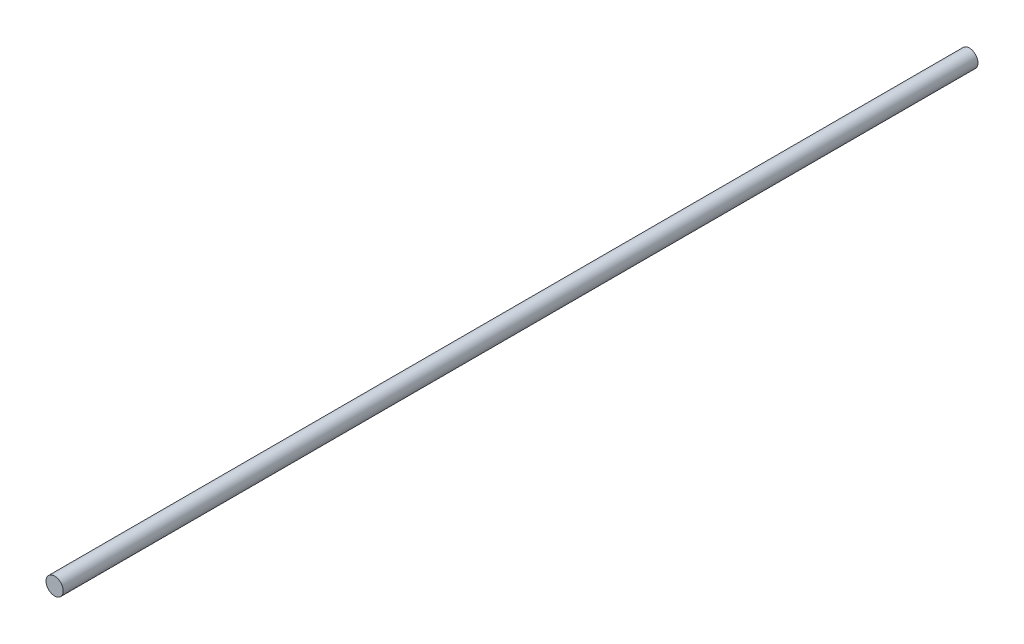
ISO-10303-21;
HEADER;
FILE_DESCRIPTION(('STEP AP214'),'2;1');
FILE_NAME('part.step','',(''),(''),'','','');
FILE_SCHEMA(('AUTOMOTIVE_DESIGN { 1 0 10303 214 1 1 1 1 }'));
ENDSEC;
DATA;
#1=APPLICATION_CONTEXT('core data for automotive mechanical design processes');
#2=APPLICATION_PROTOCOL_DEFINITION('international standard','automotive_design',2000,#1);
#3=PRODUCT_CONTEXT('',#1,'mechanical');
#4=PRODUCT('Part','Part','',(#3));
#5=PRODUCT_RELATED_PRODUCT_CATEGORY('part','',(#4));
#6=PRODUCT_DEFINITION_FORMATION('','',#4);
#7=PRODUCT_DEFINITION_CONTEXT('part definition',#1,'design');
#8=PRODUCT_DEFINITION('design','',#6,#7);
#9=PRODUCT_DEFINITION_SHAPE('','',#8);
#10=(LENGTH_UNIT() NAMED_UNIT(*) SI_UNIT(.MILLI.,.METRE.));
#11=(NAMED_UNIT(*) PLANE_ANGLE_UNIT() SI_UNIT($,.RADIAN.));
#12=(NAMED_UNIT(*) SI_UNIT($,.STERADIAN.) SOLID_ANGLE_UNIT());
#13=UNCERTAINTY_MEASURE_WITH_UNIT(LENGTH_MEASURE(1.E-05),#10,'distance_accuracy_value','');
#14=(GEOMETRIC_REPRESENTATION_CONTEXT(3) GLOBAL_UNCERTAINTY_ASSIGNED_CONTEXT((#13)) GLOBAL_UNIT_ASSIGNED_CONTEXT((#10,
#11,#12)) REPRESENTATION_CONTEXT('',''));
#15=CARTESIAN_POINT('',(0.,0.,0.));
#16=DIRECTION('',(0.,0.,1.));
#17=DIRECTION('',(1.,0.,0.));
#18=AXIS2_PLACEMENT_3D('',#15,#16,#17);
#19=CARTESIAN_POINT('',(0.,0.,530.));
#20=DIRECTION('',(0.,0.,-1.));
#21=DIRECTION('',(-1.,0.,0.));
#22=AXIS2_PLACEMENT_3D('',#19,#20,#21);
#23=CYLINDRICAL_SURFACE('',#22,10.);
#24=CARTESIAN_POINT('',(0.,0.,530.));
#25=DIRECTION('',(0.,0.,1.));
#26=DIRECTION('',(1.,0.,0.));
#27=AXIS2_PLACEMENT_3D('',#24,#25,#26);
#28=CIRCLE('',#27,10.);
#29=CARTESIAN_POINT('',(10.,0.,530.));
#30=VERTEX_POINT('',#29);
#31=EDGE_CURVE('E10',#30,#30,#28,.T.);
#32=ORIENTED_EDGE('',*,*,#31,.F.);
#33=EDGE_LOOP('',(#32));
#34=FACE_BOUND('',#33,.T.);
#35=CARTESIAN_POINT('',(0.,0.,-530.));
#36=DIRECTION('',(0.,0.,1.));
#37=DIRECTION('',(1.,0.,0.));
#38=AXIS2_PLACEMENT_3D('',#35,#36,#37);
#39=CIRCLE('',#38,10.);
#40=CARTESIAN_POINT('',(10.,0.,-530.));
#41=VERTEX_POINT('',#40);
#42=EDGE_CURVE('E36',#41,#41,#39,.T.);
#43=ORIENTED_EDGE('',*,*,#42,.T.);
#44=EDGE_LOOP('',(#43));
#45=FACE_BOUND('',#44,.T.);
#46=ADVANCED_FACE('F33',(#34,#45),#23,.T.);
#47=CARTESIAN_POINT('',(0.,0.,530.));
#48=DIRECTION('',(0.,0.,1.));
#49=DIRECTION('',(1.,0.,0.));
#50=AXIS2_PLACEMENT_3D('',#47,#48,#49);
#51=PLANE('',#50);
#52=ORIENTED_EDGE('',*,*,#31,.T.);
#53=EDGE_LOOP('',(#52));
#54=FACE_BOUND('',#53,.T.);
#55=ADVANCED_FACE('F48',(#54),#51,.T.);
#56=CARTESIAN_POINT('',(0.,0.,-530.));
#57=DIRECTION('',(0.,0.,1.));
#58=DIRECTION('',(1.,0.,0.));
#59=AXIS2_PLACEMENT_3D('',#56,#57,#58);
#60=PLANE('',#59);
#61=ORIENTED_EDGE('',*,*,#42,.F.);
#62=EDGE_LOOP('',(#61));
#63=FACE_BOUND('',#62,.T.);
#64=ADVANCED_FACE('F46',(#63),#60,.F.);
#65=CLOSED_SHELL('',(#46,#55,#64));
#66=MANIFOLD_SOLID_BREP('B2',#65);
#67=ADVANCED_BREP_SHAPE_REPRESENTATION('',(#18,#66),#14);
#68=SHAPE_DEFINITION_REPRESENTATION(#9,#67);
ENDSEC;
END-ISO-10303-21;
